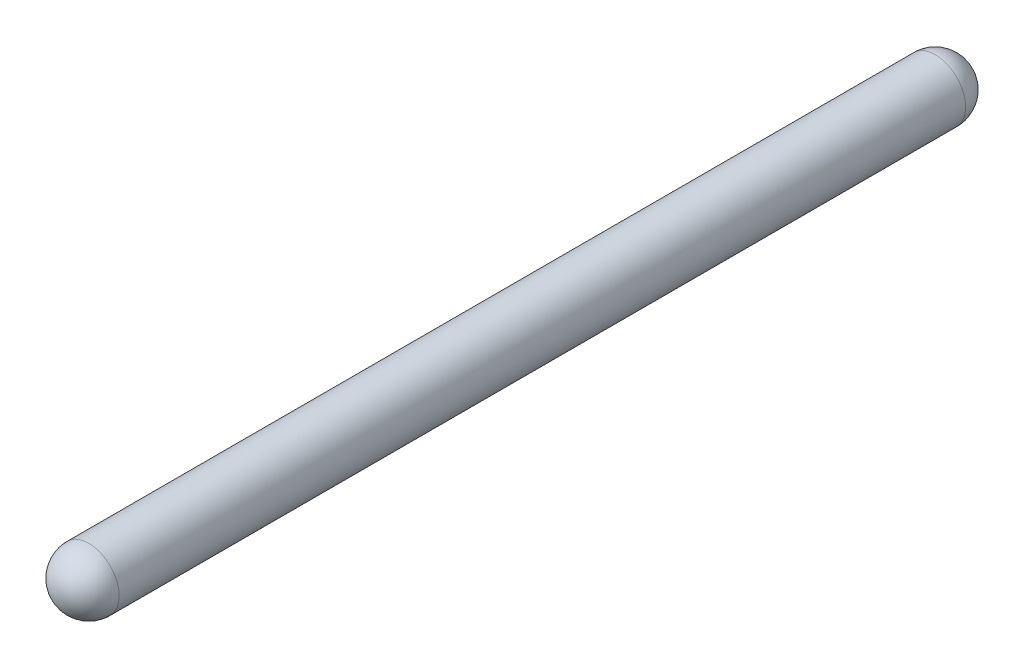
ISO-10303-21;
HEADER;
FILE_DESCRIPTION(('STEP AP214'),'2;1');
FILE_NAME('part.step','',(''),(''),'','','');
FILE_SCHEMA(('AUTOMOTIVE_DESIGN { 1 0 10303 214 1 1 1 1 }'));
ENDSEC;
DATA;
#1=APPLICATION_CONTEXT('core data for automotive mechanical design processes');
#2=APPLICATION_PROTOCOL_DEFINITION('international standard','automotive_design',2000,#1);
#3=PRODUCT_CONTEXT('',#1,'mechanical');
#4=PRODUCT('Part','Part','',(#3));
#5=PRODUCT_RELATED_PRODUCT_CATEGORY('part','',(#4));
#6=PRODUCT_DEFINITION_FORMATION('','',#4);
#7=PRODUCT_DEFINITION_CONTEXT('part definition',#1,'design');
#8=PRODUCT_DEFINITION('design','',#6,#7);
#9=PRODUCT_DEFINITION_SHAPE('','',#8);
#10=(LENGTH_UNIT() NAMED_UNIT(*) SI_UNIT(.MILLI.,.METRE.));
#11=(NAMED_UNIT(*) PLANE_ANGLE_UNIT() SI_UNIT($,.RADIAN.));
#12=(NAMED_UNIT(*) SI_UNIT($,.STERADIAN.) SOLID_ANGLE_UNIT());
#13=UNCERTAINTY_MEASURE_WITH_UNIT(LENGTH_MEASURE(1.E-05),#10,'distance_accuracy_value','');
#14=(GEOMETRIC_REPRESENTATION_CONTEXT(3) GLOBAL_UNCERTAINTY_ASSIGNED_CONTEXT((#13)) GLOBAL_UNIT_ASSIGNED_CONTEXT((#10,
#11,#12)) REPRESENTATION_CONTEXT('',''));
#15=CARTESIAN_POINT('',(0.,0.,0.));
#16=DIRECTION('',(0.,0.,1.));
#17=DIRECTION('',(1.,0.,0.));
#18=AXIS2_PLACEMENT_3D('',#15,#16,#17);
#19=CARTESIAN_POINT('',(-11.303,-5.969,-3.));
#20=DIRECTION('',(1.,0.,0.));
#21=DIRECTION('',(0.,-1.,0.));
#22=AXIS2_PLACEMENT_3D('',#19,#20,#21);
#23=SPHERICAL_SURFACE('',#22,0.3945);
#24=CARTESIAN_POINT('',(-11.303,-5.969,-3.));
#25=DIRECTION('',(0.,0.,1.));
#26=DIRECTION('',(1.,0.,0.));
#27=AXIS2_PLACEMENT_3D('',#24,#25,#26);
#28=CIRCLE('',#27,0.3945);
#29=CARTESIAN_POINT('',(-10.9085,-5.969,-3.));
#30=VERTEX_POINT('',#29);
#31=CARTESIAN_POINT('',(-11.6975,-5.969,-3.));
#32=VERTEX_POINT('',#31);
#33=EDGE_CURVE('E42',#30,#32,#28,.T.);
#34=ORIENTED_EDGE('',*,*,#33,.F.);
#35=CARTESIAN_POINT('',(-11.303,-5.969,-3.));
#36=DIRECTION('',(0.,0.,1.));
#37=DIRECTION('',(1.,0.,0.));
#38=AXIS2_PLACEMENT_3D('',#35,#36,#37);
#39=CIRCLE('',#38,0.3945);
#40=EDGE_CURVE('E26',#32,#30,#39,.T.);
#41=ORIENTED_EDGE('',*,*,#40,.F.);
#42=EDGE_LOOP('',(#34,#41));
#43=FACE_BOUND('',#42,.T.);
#44=ADVANCED_FACE('F17',(#43),#23,.T.);
#45=CARTESIAN_POINT('',(-11.303,-5.969,8.));
#46=DIRECTION('',(1.,0.,0.));
#47=DIRECTION('',(0.,1.,0.));
#48=AXIS2_PLACEMENT_3D('',#45,#46,#47);
#49=SPHERICAL_SURFACE('',#48,0.3945);
#50=CARTESIAN_POINT('',(-11.303,-5.969,8.));
#51=DIRECTION('',(0.,0.,1.));
#52=DIRECTION('',(1.,0.,0.));
#53=AXIS2_PLACEMENT_3D('',#50,#51,#52);
#54=CIRCLE('',#53,0.3945);
#55=CARTESIAN_POINT('',(-10.9085,-5.969,8.));
#56=VERTEX_POINT('',#55);
#57=CARTESIAN_POINT('',(-11.6975,-5.969,8.));
#58=VERTEX_POINT('',#57);
#59=EDGE_CURVE('E11',#56,#58,#54,.F.);
#60=ORIENTED_EDGE('',*,*,#59,.F.);
#61=CARTESIAN_POINT('',(-11.303,-5.969,8.));
#62=DIRECTION('',(0.,0.,1.));
#63=DIRECTION('',(1.,0.,0.));
#64=AXIS2_PLACEMENT_3D('',#61,#62,#63);
#65=CIRCLE('',#64,0.3945);
#66=EDGE_CURVE('E34',#58,#56,#65,.F.);
#67=ORIENTED_EDGE('',*,*,#66,.F.);
#68=EDGE_LOOP('',(#60,#67));
#69=FACE_BOUND('',#68,.T.);
#70=ADVANCED_FACE('F49',(#69),#49,.T.);
#71=CARTESIAN_POINT('',(-11.303,-5.969,-3.));
#72=DIRECTION('',(0.,0.,1.));
#73=DIRECTION('',(1.,0.,0.));
#74=AXIS2_PLACEMENT_3D('',#71,#72,#73);
#75=CYLINDRICAL_SURFACE('',#74,0.3945);
#76=ORIENTED_EDGE('',*,*,#66,.T.);
#77=ORIENTED_EDGE('',*,*,#59,.T.);
#78=EDGE_LOOP('',(#76,#77));
#79=FACE_BOUND('',#78,.T.);
#80=ORIENTED_EDGE('',*,*,#40,.T.);
#81=ORIENTED_EDGE('',*,*,#33,.T.);
#82=EDGE_LOOP('',(#80,#81));
#83=FACE_BOUND('',#82,.T.);
#84=ADVANCED_FACE('F45',(#79,#83),#75,.T.);
#85=CLOSED_SHELL('',(#44,#70,#84));
#86=MANIFOLD_SOLID_BREP('B1',#85);
#87=ADVANCED_BREP_SHAPE_REPRESENTATION('',(#18,#86),#14);
#88=SHAPE_DEFINITION_REPRESENTATION(#9,#87);
ENDSEC;
END-ISO-10303-21;
